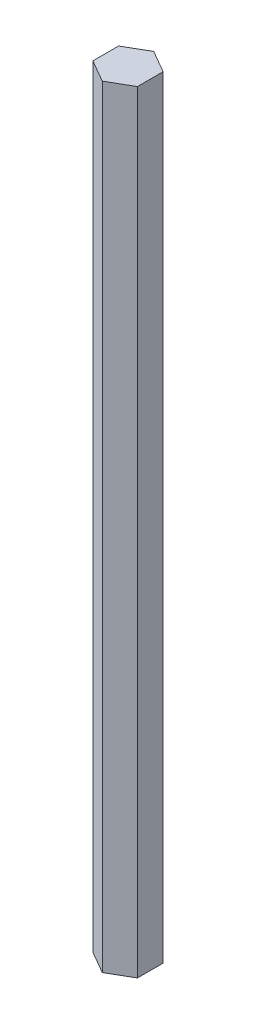
ISO-10303-21;
HEADER;
FILE_DESCRIPTION(('STEP AP214'),'2;1');
FILE_NAME('part.step','',(''),(''),'','','');
FILE_SCHEMA(('AUTOMOTIVE_DESIGN { 1 0 10303 214 1 1 1 1 }'));
ENDSEC;
DATA;
#1=APPLICATION_CONTEXT('core data for automotive mechanical design processes');
#2=APPLICATION_PROTOCOL_DEFINITION('international standard','automotive_design',2000,#1);
#3=PRODUCT_CONTEXT('',#1,'mechanical');
#4=PRODUCT('Part','Part','',(#3));
#5=PRODUCT_RELATED_PRODUCT_CATEGORY('part','',(#4));
#6=PRODUCT_DEFINITION_FORMATION('','',#4);
#7=PRODUCT_DEFINITION_CONTEXT('part definition',#1,'design');
#8=PRODUCT_DEFINITION('design','',#6,#7);
#9=PRODUCT_DEFINITION_SHAPE('','',#8);
#10=(LENGTH_UNIT() NAMED_UNIT(*) SI_UNIT(.MILLI.,.METRE.));
#11=(NAMED_UNIT(*) PLANE_ANGLE_UNIT() SI_UNIT($,.RADIAN.));
#12=(NAMED_UNIT(*) SI_UNIT($,.STERADIAN.) SOLID_ANGLE_UNIT());
#13=UNCERTAINTY_MEASURE_WITH_UNIT(LENGTH_MEASURE(1.E-05),#10,'distance_accuracy_value','');
#14=(GEOMETRIC_REPRESENTATION_CONTEXT(3) GLOBAL_UNCERTAINTY_ASSIGNED_CONTEXT((#13)) GLOBAL_UNIT_ASSIGNED_CONTEXT((#10,
#11,#12)) REPRESENTATION_CONTEXT('',''));
#15=CARTESIAN_POINT('',(0.,0.,0.));
#16=DIRECTION('',(0.,0.,1.));
#17=DIRECTION('',(1.,0.,0.));
#18=AXIS2_PLACEMENT_3D('',#15,#16,#17);
#19=CARTESIAN_POINT('',(4.7625,165.1,-1.95529291165554));
#20=DIRECTION('',(-0.5,0.,0.866025403784438));
#21=DIRECTION('',(0.866025403784439,0.,0.5));
#22=AXIS2_PLACEMENT_3D('',#19,#20,#21);
#23=PLANE('',#22);
#24=DIRECTION('',(-0.866025403784439,0.,-0.5));
#25=VECTOR('',#24,1.);
#26=CARTESIAN_POINT('',(4.7625,0.,-1.95529291165554));
#27=LINE('',#26,#25);
#28=CARTESIAN_POINT('',(4.7625,0.,-1.95529291165554));
#29=VERTEX_POINT('',#28);
#30=CARTESIAN_POINT('',(0.,0.,-4.70492356867113));
#31=VERTEX_POINT('',#30);
#32=EDGE_CURVE('E120',#29,#31,#27,.T.);
#33=ORIENTED_EDGE('',*,*,#32,.T.);
#34=DIRECTION('',(0.,-1.,0.));
#35=VECTOR('',#34,1.);
#36=CARTESIAN_POINT('',(0.,165.1,-4.70492356867113));
#37=LINE('',#36,#35);
#38=CARTESIAN_POINT('',(0.,165.1,-4.70492356867113));
#39=VERTEX_POINT('',#38);
#40=EDGE_CURVE('E11',#39,#31,#37,.T.);
#41=ORIENTED_EDGE('',*,*,#40,.F.);
#42=DIRECTION('',(-0.866025403784439,0.,-0.5));
#43=VECTOR('',#42,1.);
#44=CARTESIAN_POINT('',(4.7625,165.1,-1.95529291165554));
#45=LINE('',#44,#43);
#46=CARTESIAN_POINT('',(4.7625,165.1,-1.95529291165554));
#47=VERTEX_POINT('',#46);
#48=EDGE_CURVE('E130',#47,#39,#45,.T.);
#49=ORIENTED_EDGE('',*,*,#48,.F.);
#50=DIRECTION('',(0.,-1.,0.));
#51=VECTOR('',#50,1.);
#52=CARTESIAN_POINT('',(4.7625,165.1,-1.95529291165554));
#53=LINE('',#52,#51);
#54=EDGE_CURVE('E116',#47,#29,#53,.T.);
#55=ORIENTED_EDGE('',*,*,#54,.T.);
#56=EDGE_LOOP('',(#33,#41,#49,#55));
#57=FACE_BOUND('',#56,.T.);
#58=ADVANCED_FACE('F36',(#57),#23,.F.);
#59=CARTESIAN_POINT('',(0.,165.1,-4.70492356867113));
#60=DIRECTION('',(0.5,0.,0.866025403784439));
#61=DIRECTION('',(0.866025403784439,0.,-0.5));
#62=AXIS2_PLACEMENT_3D('',#59,#60,#61);
#63=PLANE('',#62);
#64=DIRECTION('',(-0.866025403784439,0.,0.5));
#65=VECTOR('',#64,1.);
#66=CARTESIAN_POINT('',(0.,0.,-4.70492356867113));
#67=LINE('',#66,#65);
#68=CARTESIAN_POINT('',(-4.76249999999999,0.,-1.95529291165554));
#69=VERTEX_POINT('',#68);
#70=EDGE_CURVE('E123',#31,#69,#67,.T.);
#71=ORIENTED_EDGE('',*,*,#70,.T.);
#72=DIRECTION('',(0.,-1.,0.));
#73=VECTOR('',#72,1.);
#74=CARTESIAN_POINT('',(-4.76249999999999,165.1,-1.95529291165554));
#75=LINE('',#74,#73);
#76=CARTESIAN_POINT('',(-4.76249999999999,165.1,-1.95529291165554));
#77=VERTEX_POINT('',#76);
#78=EDGE_CURVE('E44',#77,#69,#75,.T.);
#79=ORIENTED_EDGE('',*,*,#78,.F.);
#80=DIRECTION('',(-0.866025403784439,0.,0.5));
#81=VECTOR('',#80,1.);
#82=CARTESIAN_POINT('',(0.,165.1,-4.70492356867113));
#83=LINE('',#82,#81);
#84=EDGE_CURVE('E89',#39,#77,#83,.T.);
#85=ORIENTED_EDGE('',*,*,#84,.F.);
#86=ORIENTED_EDGE('',*,*,#40,.T.);
#87=EDGE_LOOP('',(#71,#79,#85,#86));
#88=FACE_BOUND('',#87,.T.);
#89=ADVANCED_FACE('F154',(#88),#63,.F.);
#90=CARTESIAN_POINT('',(-4.76249999999999,165.1,-1.95529291165554));
#91=DIRECTION('',(1.,0.,0.));
#92=DIRECTION('',(0.,0.,-1.));
#93=AXIS2_PLACEMENT_3D('',#90,#91,#92);
#94=PLANE('',#93);
#95=DIRECTION('',(0.,0.,1.));
#96=VECTOR('',#95,1.);
#97=CARTESIAN_POINT('',(-4.76249999999999,0.,-1.95529291165554));
#98=LINE('',#97,#96);
#99=CARTESIAN_POINT('',(-4.76249999999999,0.,3.54396840237564));
#100=VERTEX_POINT('',#99);
#101=EDGE_CURVE('E125',#69,#100,#98,.T.);
#102=ORIENTED_EDGE('',*,*,#101,.T.);
#103=DIRECTION('',(0.,-1.,0.));
#104=VECTOR('',#103,1.);
#105=CARTESIAN_POINT('',(-4.76249999999999,165.1,3.54396840237564));
#106=LINE('',#105,#104);
#107=CARTESIAN_POINT('',(-4.76249999999999,165.1,3.54396840237564));
#108=VERTEX_POINT('',#107);
#109=EDGE_CURVE('E111',#108,#100,#106,.T.);
#110=ORIENTED_EDGE('',*,*,#109,.F.);
#111=DIRECTION('',(0.,0.,1.));
#112=VECTOR('',#111,1.);
#113=CARTESIAN_POINT('',(-4.76249999999999,165.1,-1.95529291165554));
#114=LINE('',#113,#112);
#115=EDGE_CURVE('E102',#77,#108,#114,.T.);
#116=ORIENTED_EDGE('',*,*,#115,.F.);
#117=ORIENTED_EDGE('',*,*,#78,.T.);
#118=EDGE_LOOP('',(#102,#110,#116,#117));
#119=FACE_BOUND('',#118,.T.);
#120=ADVANCED_FACE('F136',(#119),#94,.F.);
#121=CARTESIAN_POINT('',(-4.76249999999999,165.1,3.54396840237564));
#122=DIRECTION('',(0.5,0.,-0.866025403784439));
#123=DIRECTION('',(-0.866025403784439,0.,-0.5));
#124=AXIS2_PLACEMENT_3D('',#121,#122,#123);
#125=PLANE('',#124);
#126=DIRECTION('',(0.866025403784439,0.,0.5));
#127=VECTOR('',#126,1.);
#128=CARTESIAN_POINT('',(-4.76249999999999,0.,3.54396840237564));
#129=LINE('',#128,#127);
#130=CARTESIAN_POINT('',(0.,0.,6.29359905939124));
#131=VERTEX_POINT('',#130);
#132=EDGE_CURVE('E110',#100,#131,#129,.T.);
#133=ORIENTED_EDGE('',*,*,#132,.T.);
#134=DIRECTION('',(0.,-1.,0.));
#135=VECTOR('',#134,1.);
#136=CARTESIAN_POINT('',(0.,165.1,6.29359905939124));
#137=LINE('',#136,#135);
#138=CARTESIAN_POINT('',(0.,165.1,6.29359905939124));
#139=VERTEX_POINT('',#138);
#140=EDGE_CURVE('E107',#139,#131,#137,.T.);
#141=ORIENTED_EDGE('',*,*,#140,.F.);
#142=DIRECTION('',(0.866025403784439,0.,0.5));
#143=VECTOR('',#142,1.);
#144=CARTESIAN_POINT('',(-4.76249999999999,165.1,3.54396840237564));
#145=LINE('',#144,#143);
#146=EDGE_CURVE('E96',#108,#139,#145,.T.);
#147=ORIENTED_EDGE('',*,*,#146,.F.);
#148=ORIENTED_EDGE('',*,*,#109,.T.);
#149=EDGE_LOOP('',(#133,#141,#147,#148));
#150=FACE_BOUND('',#149,.T.);
#151=ADVANCED_FACE('F108',(#150),#125,.F.);
#152=CARTESIAN_POINT('',(0.,165.1,6.29359905939124));
#153=DIRECTION('',(-0.5,0.,-0.866025403784439));
#154=DIRECTION('',(-0.866025403784439,0.,0.5));
#155=AXIS2_PLACEMENT_3D('',#152,#153,#154);
#156=PLANE('',#155);
#157=DIRECTION('',(0.866025403784439,0.,-0.5));
#158=VECTOR('',#157,1.);
#159=CARTESIAN_POINT('',(0.,0.,6.29359905939124));
#160=LINE('',#159,#158);
#161=CARTESIAN_POINT('',(4.7625,0.,3.54396840237565));
#162=VERTEX_POINT('',#161);
#163=EDGE_CURVE('E75',#131,#162,#160,.T.);
#164=ORIENTED_EDGE('',*,*,#163,.T.);
#165=DIRECTION('',(0.,-1.,0.));
#166=VECTOR('',#165,1.);
#167=CARTESIAN_POINT('',(4.7625,165.1,3.54396840237565));
#168=LINE('',#167,#166);
#169=CARTESIAN_POINT('',(4.7625,165.1,3.54396840237565));
#170=VERTEX_POINT('',#169);
#171=EDGE_CURVE('E112',#170,#162,#168,.T.);
#172=ORIENTED_EDGE('',*,*,#171,.F.);
#173=DIRECTION('',(0.866025403784439,0.,-0.5));
#174=VECTOR('',#173,1.);
#175=CARTESIAN_POINT('',(0.,165.1,6.29359905939124));
#176=LINE('',#175,#174);
#177=EDGE_CURVE('E100',#139,#170,#176,.T.);
#178=ORIENTED_EDGE('',*,*,#177,.F.);
#179=ORIENTED_EDGE('',*,*,#140,.T.);
#180=EDGE_LOOP('',(#164,#172,#178,#179));
#181=FACE_BOUND('',#180,.T.);
#182=ADVANCED_FACE('F114',(#181),#156,.F.);
#183=CARTESIAN_POINT('',(4.7625,165.1,3.54396840237565));
#184=DIRECTION('',(-1.,0.,0.));
#185=DIRECTION('',(0.,0.,1.));
#186=AXIS2_PLACEMENT_3D('',#183,#184,#185);
#187=PLANE('',#186);
#188=DIRECTION('',(0.,0.,-1.));
#189=VECTOR('',#188,1.);
#190=CARTESIAN_POINT('',(4.7625,0.,3.54396840237565));
#191=LINE('',#190,#189);
#192=EDGE_CURVE('E81',#162,#29,#191,.T.);
#193=ORIENTED_EDGE('',*,*,#192,.T.);
#194=ORIENTED_EDGE('',*,*,#54,.F.);
#195=DIRECTION('',(0.,0.,-1.));
#196=VECTOR('',#195,1.);
#197=CARTESIAN_POINT('',(4.7625,165.1,3.54396840237565));
#198=LINE('',#197,#196);
#199=EDGE_CURVE('E52',#170,#47,#198,.T.);
#200=ORIENTED_EDGE('',*,*,#199,.F.);
#201=ORIENTED_EDGE('',*,*,#171,.T.);
#202=EDGE_LOOP('',(#193,#194,#200,#201));
#203=FACE_BOUND('',#202,.T.);
#204=ADVANCED_FACE('F143',(#203),#187,.F.);
#205=CARTESIAN_POINT('',(0.,165.1,0.));
#206=DIRECTION('',(0.,1.,0.));
#207=DIRECTION('',(0.,0.,1.));
#208=AXIS2_PLACEMENT_3D('',#205,#206,#207);
#209=PLANE('',#208);
#210=ORIENTED_EDGE('',*,*,#48,.T.);
#211=ORIENTED_EDGE('',*,*,#84,.T.);
#212=ORIENTED_EDGE('',*,*,#115,.T.);
#213=ORIENTED_EDGE('',*,*,#146,.T.);
#214=ORIENTED_EDGE('',*,*,#177,.T.);
#215=ORIENTED_EDGE('',*,*,#199,.T.);
#216=EDGE_LOOP('',(#210,#211,#212,#213,#214,#215));
#217=FACE_BOUND('',#216,.T.);
#218=ADVANCED_FACE('F98',(#217),#209,.T.);
#219=CARTESIAN_POINT('',(0.,0.,0.));
#220=DIRECTION('',(0.,1.,0.));
#221=DIRECTION('',(0.,0.,1.));
#222=AXIS2_PLACEMENT_3D('',#219,#220,#221);
#223=PLANE('',#222);
#224=ORIENTED_EDGE('',*,*,#32,.F.);
#225=ORIENTED_EDGE('',*,*,#192,.F.);
#226=ORIENTED_EDGE('',*,*,#163,.F.);
#227=ORIENTED_EDGE('',*,*,#132,.F.);
#228=ORIENTED_EDGE('',*,*,#101,.F.);
#229=ORIENTED_EDGE('',*,*,#70,.F.);
#230=EDGE_LOOP('',(#224,#225,#226,#227,#228,#229));
#231=FACE_BOUND('',#230,.T.);
#232=ADVANCED_FACE('F139',(#231),#223,.F.);
#233=CLOSED_SHELL('',(#58,#89,#120,#151,#182,#204,#218,#232));
#234=MANIFOLD_SOLID_BREP('B2',#233);
#235=ADVANCED_BREP_SHAPE_REPRESENTATION('',(#18,#234),#14);
#236=SHAPE_DEFINITION_REPRESENTATION(#9,#235);
ENDSEC;
END-ISO-10303-21;
